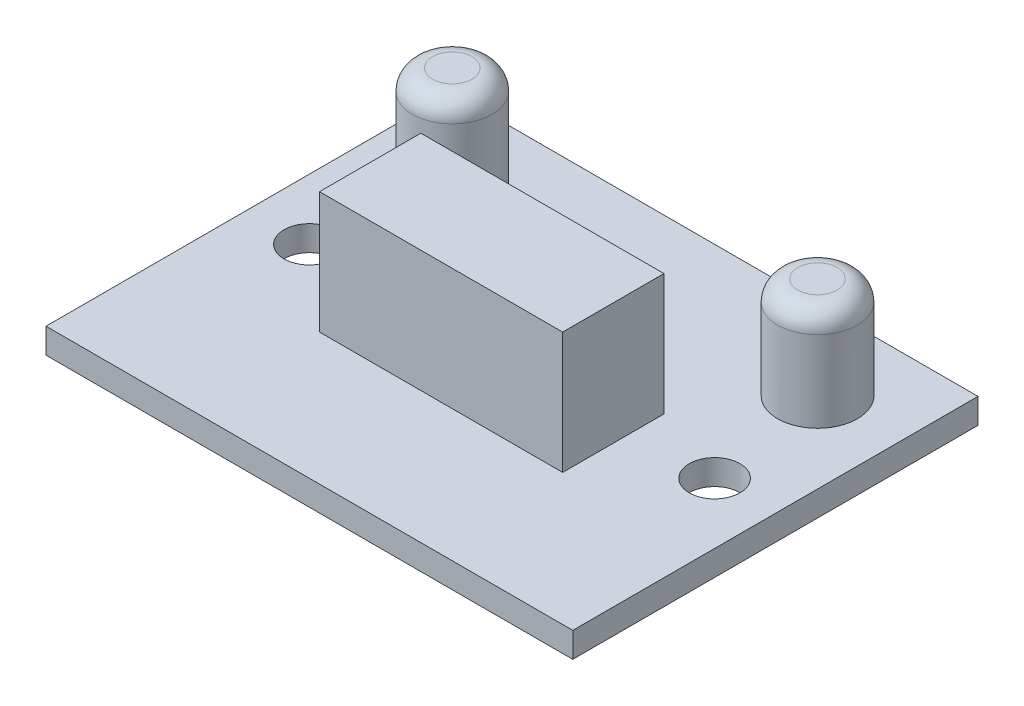
ISO-10303-21;
HEADER;
FILE_DESCRIPTION(('STEP AP214'),'2;1');
FILE_NAME('part.step','',(''),(''),'','','');
FILE_SCHEMA(('AUTOMOTIVE_DESIGN { 1 0 10303 214 1 1 1 1 }'));
ENDSEC;
DATA;
#1=APPLICATION_CONTEXT('core data for automotive mechanical design processes');
#2=APPLICATION_PROTOCOL_DEFINITION('international standard','automotive_design',2000,#1);
#3=PRODUCT_CONTEXT('',#1,'mechanical');
#4=PRODUCT('Part','Part','',(#3));
#5=PRODUCT_RELATED_PRODUCT_CATEGORY('part','',(#4));
#6=PRODUCT_DEFINITION_FORMATION('','',#4);
#7=PRODUCT_DEFINITION_CONTEXT('part definition',#1,'design');
#8=PRODUCT_DEFINITION('design','',#6,#7);
#9=PRODUCT_DEFINITION_SHAPE('','',#8);
#10=(LENGTH_UNIT() NAMED_UNIT(*) SI_UNIT(.MILLI.,.METRE.));
#11=(NAMED_UNIT(*) PLANE_ANGLE_UNIT() SI_UNIT($,.RADIAN.));
#12=(NAMED_UNIT(*) SI_UNIT($,.STERADIAN.) SOLID_ANGLE_UNIT());
#13=UNCERTAINTY_MEASURE_WITH_UNIT(LENGTH_MEASURE(1.E-05),#10,'distance_accuracy_value','');
#14=(GEOMETRIC_REPRESENTATION_CONTEXT(3) GLOBAL_UNCERTAINTY_ASSIGNED_CONTEXT((#13)) GLOBAL_UNIT_ASSIGNED_CONTEXT((#10,
#11,#12)) REPRESENTATION_CONTEXT('',''));
#15=CARTESIAN_POINT('',(0.,0.,0.));
#16=DIRECTION('',(0.,0.,1.));
#17=DIRECTION('',(1.,0.,0.));
#18=AXIS2_PLACEMENT_3D('',#15,#16,#17);
#19=CARTESIAN_POINT('',(0.,1.5748,-25.4));
#20=DIRECTION('',(0.,-1.,0.));
#21=DIRECTION('',(0.,0.,-1.));
#22=AXIS2_PLACEMENT_3D('',#19,#20,#21);
#23=PLANE('',#22);
#24=CARTESIAN_POINT('',(5.0633311863848,1.5748,-20.4048120861695));
#25=DIRECTION('',(0.,-1.,0.));
#26=DIRECTION('',(0.,0.,-1.));
#27=AXIS2_PLACEMENT_3D('',#24,#25,#26);
#28=CIRCLE('',#27,2.5);
#29=CARTESIAN_POINT('',(5.0633311863848,1.5748,-22.9048120861695));
#30=VERTEX_POINT('',#29);
#31=EDGE_CURVE('E166',#30,#30,#28,.F.);
#32=ORIENTED_EDGE('',*,*,#31,.F.);
#33=EDGE_LOOP('',(#32));
#34=FACE_BOUND('',#33,.T.);
#35=CARTESIAN_POINT('',(29.21,1.5748,-12.7));
#36=DIRECTION('',(0.,1.,0.));
#37=DIRECTION('',(0.,0.,1.));
#38=AXIS2_PLACEMENT_3D('',#35,#36,#37);
#39=CIRCLE('',#38,1.5875);
#40=CARTESIAN_POINT('',(29.21,1.5748,-11.1125));
#41=VERTEX_POINT('',#40);
#42=EDGE_CURVE('E122',#41,#41,#39,.T.);
#43=ORIENTED_EDGE('',*,*,#42,.F.);
#44=EDGE_LOOP('',(#43));
#45=FACE_BOUND('',#44,.T.);
#46=DIRECTION('',(0.,0.,1.));
#47=VECTOR('',#46,1.);
#48=CARTESIAN_POINT('',(0.,1.5748,0.));
#49=LINE('',#48,#47);
#50=CARTESIAN_POINT('',(0.,1.5748,-25.4));
#51=VERTEX_POINT('',#50);
#52=CARTESIAN_POINT('',(0.,1.5748,0.));
#53=VERTEX_POINT('',#52);
#54=EDGE_CURVE('E137',#51,#53,#49,.T.);
#55=ORIENTED_EDGE('',*,*,#54,.T.);
#56=DIRECTION('',(1.,0.,0.));
#57=VECTOR('',#56,1.);
#58=CARTESIAN_POINT('',(0.,1.5748,0.));
#59=LINE('',#58,#57);
#60=CARTESIAN_POINT('',(33.02,1.5748,0.));
#61=VERTEX_POINT('',#60);
#62=EDGE_CURVE('E140',#53,#61,#59,.T.);
#63=ORIENTED_EDGE('',*,*,#62,.T.);
#64=DIRECTION('',(0.,0.,-1.));
#65=VECTOR('',#64,1.);
#66=CARTESIAN_POINT('',(33.02,1.5748,0.));
#67=LINE('',#66,#65);
#68=CARTESIAN_POINT('',(33.02,1.5748,-25.4));
#69=VERTEX_POINT('',#68);
#70=EDGE_CURVE('E143',#61,#69,#67,.T.);
#71=ORIENTED_EDGE('',*,*,#70,.T.);
#72=DIRECTION('',(-1.,0.,0.));
#73=VECTOR('',#72,1.);
#74=CARTESIAN_POINT('',(0.,1.5748,-25.4));
#75=LINE('',#74,#73);
#76=EDGE_CURVE('E145',#69,#51,#75,.T.);
#77=ORIENTED_EDGE('',*,*,#76,.T.);
#78=EDGE_LOOP('',(#55,#63,#71,#77));
#79=FACE_BOUND('',#78,.T.);
#80=CARTESIAN_POINT('',(3.81,1.5748,-12.7));
#81=DIRECTION('',(0.,1.,0.));
#82=DIRECTION('',(0.,0.,1.));
#83=AXIS2_PLACEMENT_3D('',#80,#81,#82);
#84=CIRCLE('',#83,1.5875);
#85=CARTESIAN_POINT('',(3.81,1.5748,-11.1125));
#86=VERTEX_POINT('',#85);
#87=EDGE_CURVE('E131',#86,#86,#84,.T.);
#88=ORIENTED_EDGE('',*,*,#87,.F.);
#89=EDGE_LOOP('',(#88));
#90=FACE_BOUND('',#89,.T.);
#91=DIRECTION('',(0.,0.,1.));
#92=VECTOR('',#91,1.);
#93=CARTESIAN_POINT('',(8.89,1.5748,-14.605));
#94=LINE('',#93,#92);
#95=CARTESIAN_POINT('',(8.89,1.5748,-14.605));
#96=VERTEX_POINT('',#95);
#97=CARTESIAN_POINT('',(8.89,1.5748,-8.255));
#98=VERTEX_POINT('',#97);
#99=EDGE_CURVE('E118',#96,#98,#94,.T.);
#100=ORIENTED_EDGE('',*,*,#99,.F.);
#101=DIRECTION('',(-1.,0.,0.));
#102=VECTOR('',#101,1.);
#103=CARTESIAN_POINT('',(8.89,1.5748,-14.605));
#104=LINE('',#103,#102);
#105=CARTESIAN_POINT('',(24.13,1.5748,-14.605));
#106=VERTEX_POINT('',#105);
#107=EDGE_CURVE('E115',#106,#96,#104,.T.);
#108=ORIENTED_EDGE('',*,*,#107,.F.);
#109=DIRECTION('',(0.,0.,-1.));
#110=VECTOR('',#109,1.);
#111=CARTESIAN_POINT('',(24.13,1.5748,-14.605));
#112=LINE('',#111,#110);
#113=CARTESIAN_POINT('',(24.13,1.5748,-8.255));
#114=VERTEX_POINT('',#113);
#115=EDGE_CURVE('E53',#114,#106,#112,.T.);
#116=ORIENTED_EDGE('',*,*,#115,.F.);
#117=DIRECTION('',(1.,0.,0.));
#118=VECTOR('',#117,1.);
#119=CARTESIAN_POINT('',(8.89,1.5748,-8.255));
#120=LINE('',#119,#118);
#121=EDGE_CURVE('E48',#98,#114,#120,.T.);
#122=ORIENTED_EDGE('',*,*,#121,.F.);
#123=EDGE_LOOP('',(#100,#108,#116,#122));
#124=FACE_BOUND('',#123,.T.);
#125=CARTESIAN_POINT('',(27.9566688136152,1.5748,-20.4048120861695));
#126=DIRECTION('',(0.,-1.,0.));
#127=DIRECTION('',(0.,0.,-1.));
#128=AXIS2_PLACEMENT_3D('',#125,#126,#127);
#129=CIRCLE('',#128,2.49999999999999);
#130=CARTESIAN_POINT('',(27.9566688136152,1.5748,-22.9048120861695));
#131=VERTEX_POINT('',#130);
#132=EDGE_CURVE('E169',#131,#131,#129,.F.);
#133=ORIENTED_EDGE('',*,*,#132,.F.);
#134=EDGE_LOOP('',(#133));
#135=FACE_BOUND('',#134,.T.);
#136=ADVANCED_FACE('F33',(#34,#45,#79,#90,#124,#135),#23,.F.);
#137=CARTESIAN_POINT('',(0.,0.,-25.4));
#138=DIRECTION('',(0.,-1.,0.));
#139=DIRECTION('',(0.,0.,-1.));
#140=AXIS2_PLACEMENT_3D('',#137,#138,#139);
#141=PLANE('',#140);
#142=CARTESIAN_POINT('',(3.81,0.,-12.7));
#143=DIRECTION('',(0.,1.,0.));
#144=DIRECTION('',(0.,0.,1.));
#145=AXIS2_PLACEMENT_3D('',#142,#143,#144);
#146=CIRCLE('',#145,1.5875);
#147=CARTESIAN_POINT('',(3.81,0.,-11.1125));
#148=VERTEX_POINT('',#147);
#149=EDGE_CURVE('E129',#148,#148,#146,.T.);
#150=ORIENTED_EDGE('',*,*,#149,.T.);
#151=EDGE_LOOP('',(#150));
#152=FACE_BOUND('',#151,.T.);
#153=DIRECTION('',(0.,0.,1.));
#154=VECTOR('',#153,1.);
#155=CARTESIAN_POINT('',(0.,0.,0.));
#156=LINE('',#155,#154);
#157=CARTESIAN_POINT('',(0.,0.,-25.4));
#158=VERTEX_POINT('',#157);
#159=CARTESIAN_POINT('',(0.,0.,0.));
#160=VERTEX_POINT('',#159);
#161=EDGE_CURVE('E134',#158,#160,#156,.T.);
#162=ORIENTED_EDGE('',*,*,#161,.F.);
#163=DIRECTION('',(-1.,0.,0.));
#164=VECTOR('',#163,1.);
#165=CARTESIAN_POINT('',(0.,0.,-25.4));
#166=LINE('',#165,#164);
#167=CARTESIAN_POINT('',(33.02,0.,-25.4));
#168=VERTEX_POINT('',#167);
#169=EDGE_CURVE('E141',#168,#158,#166,.T.);
#170=ORIENTED_EDGE('',*,*,#169,.F.);
#171=DIRECTION('',(0.,0.,-1.));
#172=VECTOR('',#171,1.);
#173=CARTESIAN_POINT('',(33.02,0.,0.));
#174=LINE('',#173,#172);
#175=CARTESIAN_POINT('',(33.02,0.,0.));
#176=VERTEX_POINT('',#175);
#177=EDGE_CURVE('E152',#176,#168,#174,.T.);
#178=ORIENTED_EDGE('',*,*,#177,.F.);
#179=DIRECTION('',(1.,0.,0.));
#180=VECTOR('',#179,1.);
#181=CARTESIAN_POINT('',(0.,0.,0.));
#182=LINE('',#181,#180);
#183=EDGE_CURVE('E150',#160,#176,#182,.T.);
#184=ORIENTED_EDGE('',*,*,#183,.F.);
#185=EDGE_LOOP('',(#162,#170,#178,#184));
#186=FACE_BOUND('',#185,.T.);
#187=CARTESIAN_POINT('',(29.21,0.,-12.7));
#188=DIRECTION('',(0.,1.,0.));
#189=DIRECTION('',(0.,0.,1.));
#190=AXIS2_PLACEMENT_3D('',#187,#188,#189);
#191=CIRCLE('',#190,1.5875);
#192=CARTESIAN_POINT('',(29.21,0.,-11.1125));
#193=VERTEX_POINT('',#192);
#194=EDGE_CURVE('E119',#193,#193,#191,.T.);
#195=ORIENTED_EDGE('',*,*,#194,.T.);
#196=EDGE_LOOP('',(#195));
#197=FACE_BOUND('',#196,.T.);
#198=ADVANCED_FACE('F192',(#152,#186,#197),#141,.T.);
#199=CARTESIAN_POINT('',(0.,1.5748,0.));
#200=DIRECTION('',(1.,0.,0.));
#201=DIRECTION('',(0.,0.,-1.));
#202=AXIS2_PLACEMENT_3D('',#199,#200,#201);
#203=PLANE('',#202);
#204=ORIENTED_EDGE('',*,*,#161,.T.);
#205=DIRECTION('',(0.,-1.,0.));
#206=VECTOR('',#205,1.);
#207=CARTESIAN_POINT('',(0.,1.5748,0.));
#208=LINE('',#207,#206);
#209=EDGE_CURVE('E163',#53,#160,#208,.T.);
#210=ORIENTED_EDGE('',*,*,#209,.F.);
#211=ORIENTED_EDGE('',*,*,#54,.F.);
#212=DIRECTION('',(0.,-1.,0.));
#213=VECTOR('',#212,1.);
#214=CARTESIAN_POINT('',(0.,1.5748,-25.4));
#215=LINE('',#214,#213);
#216=EDGE_CURVE('E147',#51,#158,#215,.T.);
#217=ORIENTED_EDGE('',*,*,#216,.T.);
#218=EDGE_LOOP('',(#204,#210,#211,#217));
#219=FACE_BOUND('',#218,.T.);
#220=ADVANCED_FACE('F198',(#219),#203,.F.);
#221=CARTESIAN_POINT('',(0.,1.5748,0.));
#222=DIRECTION('',(0.,0.,-1.));
#223=DIRECTION('',(-1.,0.,0.));
#224=AXIS2_PLACEMENT_3D('',#221,#222,#223);
#225=PLANE('',#224);
#226=ORIENTED_EDGE('',*,*,#183,.T.);
#227=DIRECTION('',(0.,-1.,0.));
#228=VECTOR('',#227,1.);
#229=CARTESIAN_POINT('',(33.02,1.5748,0.));
#230=LINE('',#229,#228);
#231=EDGE_CURVE('E160',#61,#176,#230,.T.);
#232=ORIENTED_EDGE('',*,*,#231,.F.);
#233=ORIENTED_EDGE('',*,*,#62,.F.);
#234=ORIENTED_EDGE('',*,*,#209,.T.);
#235=EDGE_LOOP('',(#226,#232,#233,#234));
#236=FACE_BOUND('',#235,.T.);
#237=ADVANCED_FACE('F214',(#236),#225,.F.);
#238=CARTESIAN_POINT('',(33.02,1.5748,0.));
#239=DIRECTION('',(-1.,0.,0.));
#240=DIRECTION('',(0.,0.,1.));
#241=AXIS2_PLACEMENT_3D('',#238,#239,#240);
#242=PLANE('',#241);
#243=ORIENTED_EDGE('',*,*,#177,.T.);
#244=DIRECTION('',(0.,-1.,0.));
#245=VECTOR('',#244,1.);
#246=CARTESIAN_POINT('',(33.02,1.5748,-25.4));
#247=LINE('',#246,#245);
#248=EDGE_CURVE('E157',#69,#168,#247,.T.);
#249=ORIENTED_EDGE('',*,*,#248,.F.);
#250=ORIENTED_EDGE('',*,*,#70,.F.);
#251=ORIENTED_EDGE('',*,*,#231,.T.);
#252=EDGE_LOOP('',(#243,#249,#250,#251));
#253=FACE_BOUND('',#252,.T.);
#254=ADVANCED_FACE('F210',(#253),#242,.F.);
#255=CARTESIAN_POINT('',(0.,1.5748,-25.4));
#256=DIRECTION('',(0.,0.,1.));
#257=DIRECTION('',(1.,0.,0.));
#258=AXIS2_PLACEMENT_3D('',#255,#256,#257);
#259=PLANE('',#258);
#260=ORIENTED_EDGE('',*,*,#169,.T.);
#261=ORIENTED_EDGE('',*,*,#216,.F.);
#262=ORIENTED_EDGE('',*,*,#76,.F.);
#263=ORIENTED_EDGE('',*,*,#248,.T.);
#264=EDGE_LOOP('',(#260,#261,#262,#263));
#265=FACE_BOUND('',#264,.T.);
#266=ADVANCED_FACE('F207',(#265),#259,.F.);
#267=CARTESIAN_POINT('',(3.81,1.5748,-12.7));
#268=DIRECTION('',(0.,-1.,0.));
#269=DIRECTION('',(0.,0.,-1.));
#270=AXIS2_PLACEMENT_3D('',#267,#268,#269);
#271=CYLINDRICAL_SURFACE('',#270,1.5875);
#272=ORIENTED_EDGE('',*,*,#87,.T.);
#273=EDGE_LOOP('',(#272));
#274=FACE_BOUND('',#273,.T.);
#275=ORIENTED_EDGE('',*,*,#149,.F.);
#276=EDGE_LOOP('',(#275));
#277=FACE_BOUND('',#276,.T.);
#278=ADVANCED_FACE('F204',(#274,#277),#271,.F.);
#279=CARTESIAN_POINT('',(29.21,1.5748,-12.7));
#280=DIRECTION('',(0.,-1.,0.));
#281=DIRECTION('',(0.,0.,-1.));
#282=AXIS2_PLACEMENT_3D('',#279,#280,#281);
#283=CYLINDRICAL_SURFACE('',#282,1.5875);
#284=ORIENTED_EDGE('',*,*,#42,.T.);
#285=EDGE_LOOP('',(#284));
#286=FACE_BOUND('',#285,.T.);
#287=ORIENTED_EDGE('',*,*,#194,.F.);
#288=EDGE_LOOP('',(#287));
#289=FACE_BOUND('',#288,.T.);
#290=ADVANCED_FACE('F271',(#286,#289),#283,.F.);
#291=CARTESIAN_POINT('',(8.89,9.1948,-14.605));
#292=DIRECTION('',(1.,0.,0.));
#293=DIRECTION('',(0.,0.,-1.));
#294=AXIS2_PLACEMENT_3D('',#291,#292,#293);
#295=PLANE('',#294);
#296=ORIENTED_EDGE('',*,*,#99,.T.);
#297=DIRECTION('',(0.,-1.,0.));
#298=VECTOR('',#297,1.);
#299=CARTESIAN_POINT('',(8.89,9.1948,-8.255));
#300=LINE('',#299,#298);
#301=CARTESIAN_POINT('',(8.89,9.1948,-8.255));
#302=VERTEX_POINT('',#301);
#303=EDGE_CURVE('E99',#302,#98,#300,.T.);
#304=ORIENTED_EDGE('',*,*,#303,.F.);
#305=DIRECTION('',(0.,0.,1.));
#306=VECTOR('',#305,1.);
#307=CARTESIAN_POINT('',(8.89,9.1948,-14.605));
#308=LINE('',#307,#306);
#309=CARTESIAN_POINT('',(8.89,9.1948,-14.605));
#310=VERTEX_POINT('',#309);
#311=EDGE_CURVE('E106',#310,#302,#308,.T.);
#312=ORIENTED_EDGE('',*,*,#311,.F.);
#313=DIRECTION('',(0.,-1.,0.));
#314=VECTOR('',#313,1.);
#315=CARTESIAN_POINT('',(8.89,9.1948,-14.605));
#316=LINE('',#315,#314);
#317=EDGE_CURVE('E390',#310,#96,#316,.T.);
#318=ORIENTED_EDGE('',*,*,#317,.T.);
#319=EDGE_LOOP('',(#296,#304,#312,#318));
#320=FACE_BOUND('',#319,.T.);
#321=ADVANCED_FACE('F117',(#320),#295,.F.);
#322=CARTESIAN_POINT('',(8.89,9.1948,-8.255));
#323=DIRECTION('',(0.,0.,-1.));
#324=DIRECTION('',(-1.,0.,0.));
#325=AXIS2_PLACEMENT_3D('',#322,#323,#324);
#326=PLANE('',#325);
#327=ORIENTED_EDGE('',*,*,#121,.T.);
#328=DIRECTION('',(0.,-1.,0.));
#329=VECTOR('',#328,1.);
#330=CARTESIAN_POINT('',(24.13,9.1948,-8.255));
#331=LINE('',#330,#329);
#332=CARTESIAN_POINT('',(24.13,9.1948,-8.255));
#333=VERTEX_POINT('',#332);
#334=EDGE_CURVE('E102',#333,#114,#331,.T.);
#335=ORIENTED_EDGE('',*,*,#334,.F.);
#336=DIRECTION('',(1.,0.,0.));
#337=VECTOR('',#336,1.);
#338=CARTESIAN_POINT('',(8.89,9.1948,-8.255));
#339=LINE('',#338,#337);
#340=EDGE_CURVE('E95',#302,#333,#339,.T.);
#341=ORIENTED_EDGE('',*,*,#340,.F.);
#342=ORIENTED_EDGE('',*,*,#303,.T.);
#343=EDGE_LOOP('',(#327,#335,#341,#342));
#344=FACE_BOUND('',#343,.T.);
#345=ADVANCED_FACE('F97',(#344),#326,.F.);
#346=CARTESIAN_POINT('',(24.13,9.1948,-14.605));
#347=DIRECTION('',(-1.,0.,0.));
#348=DIRECTION('',(0.,0.,1.));
#349=AXIS2_PLACEMENT_3D('',#346,#347,#348);
#350=PLANE('',#349);
#351=ORIENTED_EDGE('',*,*,#115,.T.);
#352=DIRECTION('',(0.,-1.,0.));
#353=VECTOR('',#352,1.);
#354=CARTESIAN_POINT('',(24.13,9.1948,-14.605));
#355=LINE('',#354,#353);
#356=CARTESIAN_POINT('',(24.13,9.1948,-14.605));
#357=VERTEX_POINT('',#356);
#358=EDGE_CURVE('E124',#357,#106,#355,.T.);
#359=ORIENTED_EDGE('',*,*,#358,.F.);
#360=DIRECTION('',(0.,0.,-1.));
#361=VECTOR('',#360,1.);
#362=CARTESIAN_POINT('',(24.13,9.1948,-14.605));
#363=LINE('',#362,#361);
#364=EDGE_CURVE('E105',#333,#357,#363,.T.);
#365=ORIENTED_EDGE('',*,*,#364,.F.);
#366=ORIENTED_EDGE('',*,*,#334,.T.);
#367=EDGE_LOOP('',(#351,#359,#365,#366));
#368=FACE_BOUND('',#367,.T.);
#369=ADVANCED_FACE('F263',(#368),#350,.F.);
#370=CARTESIAN_POINT('',(8.89,9.1948,-14.605));
#371=DIRECTION('',(0.,0.,1.));
#372=DIRECTION('',(1.,0.,0.));
#373=AXIS2_PLACEMENT_3D('',#370,#371,#372);
#374=PLANE('',#373);
#375=ORIENTED_EDGE('',*,*,#107,.T.);
#376=ORIENTED_EDGE('',*,*,#317,.F.);
#377=DIRECTION('',(-1.,0.,0.));
#378=VECTOR('',#377,1.);
#379=CARTESIAN_POINT('',(8.89,9.1948,-14.605));
#380=LINE('',#379,#378);
#381=EDGE_CURVE('E111',#357,#310,#380,.T.);
#382=ORIENTED_EDGE('',*,*,#381,.F.);
#383=ORIENTED_EDGE('',*,*,#358,.T.);
#384=EDGE_LOOP('',(#375,#376,#382,#383));
#385=FACE_BOUND('',#384,.T.);
#386=ADVANCED_FACE('F260',(#385),#374,.F.);
#387=CARTESIAN_POINT('',(8.89,9.1948,-8.255));
#388=DIRECTION('',(0.,1.,0.));
#389=DIRECTION('',(0.,0.,1.));
#390=AXIS2_PLACEMENT_3D('',#387,#388,#389);
#391=PLANE('',#390);
#392=ORIENTED_EDGE('',*,*,#311,.T.);
#393=ORIENTED_EDGE('',*,*,#340,.T.);
#394=ORIENTED_EDGE('',*,*,#364,.T.);
#395=ORIENTED_EDGE('',*,*,#381,.T.);
#396=EDGE_LOOP('',(#392,#393,#394,#395));
#397=FACE_BOUND('',#396,.T.);
#398=ADVANCED_FACE('F109',(#397),#391,.T.);
#399=CARTESIAN_POINT('',(5.0633311863848,7.9248,-20.4048120861695));
#400=DIRECTION('',(0.,-1.,0.));
#401=DIRECTION('',(0.,0.,-1.));
#402=AXIS2_PLACEMENT_3D('',#399,#400,#401);
#403=CYLINDRICAL_SURFACE('',#402,2.5);
#404=CARTESIAN_POINT('',(5.0633311863848,6.6548,-20.4048120861695));
#405=DIRECTION('',(0.,1.,0.));
#406=DIRECTION('',(0.,0.,1.));
#407=AXIS2_PLACEMENT_3D('',#404,#405,#406);
#408=CIRCLE('',#407,2.5);
#409=CARTESIAN_POINT('',(5.0633311863848,6.6548,-17.9048120861695));
#410=VERTEX_POINT('',#409);
#411=EDGE_CURVE('E11',#410,#410,#408,.F.);
#412=ORIENTED_EDGE('',*,*,#411,.T.);
#413=EDGE_LOOP('',(#412));
#414=FACE_BOUND('',#413,.T.);
#415=ORIENTED_EDGE('',*,*,#31,.T.);
#416=EDGE_LOOP('',(#415));
#417=FACE_BOUND('',#416,.T.);
#418=ADVANCED_FACE('F252',(#414,#417),#403,.T.);
#419=CARTESIAN_POINT('',(5.0633311863848,7.9248,-20.4048120861695));
#420=DIRECTION('',(0.,1.,0.));
#421=DIRECTION('',(0.,0.,1.));
#422=AXIS2_PLACEMENT_3D('',#419,#420,#421);
#423=PLANE('',#422);
#424=CARTESIAN_POINT('',(5.0633311863848,7.9248,-20.4048120861695));
#425=DIRECTION('',(0.,1.,0.));
#426=DIRECTION('',(0.,0.,1.));
#427=AXIS2_PLACEMENT_3D('',#424,#425,#426);
#428=CIRCLE('',#427,1.23);
#429=CARTESIAN_POINT('',(5.0633311863848,7.9248,-19.1748120861695));
#430=VERTEX_POINT('',#429);
#431=EDGE_CURVE('E41',#430,#430,#428,.T.);
#432=ORIENTED_EDGE('',*,*,#431,.T.);
#433=EDGE_LOOP('',(#432));
#434=FACE_BOUND('',#433,.T.);
#435=ADVANCED_FACE('F180',(#434),#423,.T.);
#436=CARTESIAN_POINT('',(27.9566688136152,7.9248,-20.4048120861695));
#437=DIRECTION('',(0.,-1.,0.));
#438=DIRECTION('',(0.,0.,-1.));
#439=AXIS2_PLACEMENT_3D('',#436,#437,#438);
#440=CYLINDRICAL_SURFACE('',#439,2.49999999999999);
#441=CARTESIAN_POINT('',(27.9566688136152,6.6548,-20.4048120861695));
#442=DIRECTION('',(0.,1.,0.));
#443=DIRECTION('',(0.,0.,1.));
#444=AXIS2_PLACEMENT_3D('',#441,#442,#443);
#445=CIRCLE('',#444,2.49999999999999);
#446=CARTESIAN_POINT('',(27.9566688136152,6.6548,-17.9048120861695));
#447=VERTEX_POINT('',#446);
#448=EDGE_CURVE('E175',#447,#447,#445,.F.);
#449=ORIENTED_EDGE('',*,*,#448,.T.);
#450=EDGE_LOOP('',(#449));
#451=FACE_BOUND('',#450,.T.);
#452=ORIENTED_EDGE('',*,*,#132,.T.);
#453=EDGE_LOOP('',(#452));
#454=FACE_BOUND('',#453,.T.);
#455=ADVANCED_FACE('F242',(#451,#454),#440,.T.);
#456=CARTESIAN_POINT('',(27.9566688136152,7.9248,-20.4048120861695));
#457=DIRECTION('',(0.,1.,0.));
#458=DIRECTION('',(0.,0.,1.));
#459=AXIS2_PLACEMENT_3D('',#456,#457,#458);
#460=PLANE('',#459);
#461=CARTESIAN_POINT('',(27.9566688136152,7.9248,-20.4048120861695));
#462=DIRECTION('',(0.,1.,0.));
#463=DIRECTION('',(0.,0.,1.));
#464=AXIS2_PLACEMENT_3D('',#461,#462,#463);
#465=CIRCLE('',#464,1.22999999999999);
#466=CARTESIAN_POINT('',(27.9566688136152,7.9248,-19.1748120861695));
#467=VERTEX_POINT('',#466);
#468=EDGE_CURVE('E172',#467,#467,#465,.T.);
#469=ORIENTED_EDGE('',*,*,#468,.T.);
#470=EDGE_LOOP('',(#469));
#471=FACE_BOUND('',#470,.T.);
#472=ADVANCED_FACE('F188',(#471),#460,.T.);
#473=CARTESIAN_POINT('',(27.9566688136152,6.6548,-20.4048120861695));
#474=DIRECTION('',(0.,1.,0.));
#475=DIRECTION('',(0.,0.,1.));
#476=AXIS2_PLACEMENT_3D('',#473,#474,#475);
#477=DEGENERATE_TOROIDAL_SURFACE('',#476,1.22999999999999,1.27,.T.);
#478=ORIENTED_EDGE('',*,*,#448,.F.);
#479=EDGE_LOOP('',(#478));
#480=FACE_BOUND('',#479,.T.);
#481=ORIENTED_EDGE('',*,*,#468,.F.);
#482=EDGE_LOOP('',(#481));
#483=FACE_BOUND('',#482,.T.);
#484=ADVANCED_FACE('F183',(#480,#483),#477,.T.);
#485=CARTESIAN_POINT('',(5.0633311863848,6.6548,-20.4048120861695));
#486=DIRECTION('',(0.,1.,0.));
#487=DIRECTION('',(0.,0.,1.));
#488=AXIS2_PLACEMENT_3D('',#485,#486,#487);
#489=DEGENERATE_TOROIDAL_SURFACE('',#488,1.23,1.27,.T.);
#490=ORIENTED_EDGE('',*,*,#411,.F.);
#491=EDGE_LOOP('',(#490));
#492=FACE_BOUND('',#491,.T.);
#493=ORIENTED_EDGE('',*,*,#431,.F.);
#494=EDGE_LOOP('',(#493));
#495=FACE_BOUND('',#494,.T.);
#496=ADVANCED_FACE('F35',(#492,#495),#489,.T.);
#497=CLOSED_SHELL('',(#136,#198,#220,#237,#254,#266,#278,#290,#321,#345,#369,#386,#398,#418,
#435,#455,#472,#484,#496));
#498=MANIFOLD_SOLID_BREP('B2',#497);
#499=ADVANCED_BREP_SHAPE_REPRESENTATION('',(#18,#498),#14);
#500=SHAPE_DEFINITION_REPRESENTATION(#9,#499);
ENDSEC;
END-ISO-10303-21;
